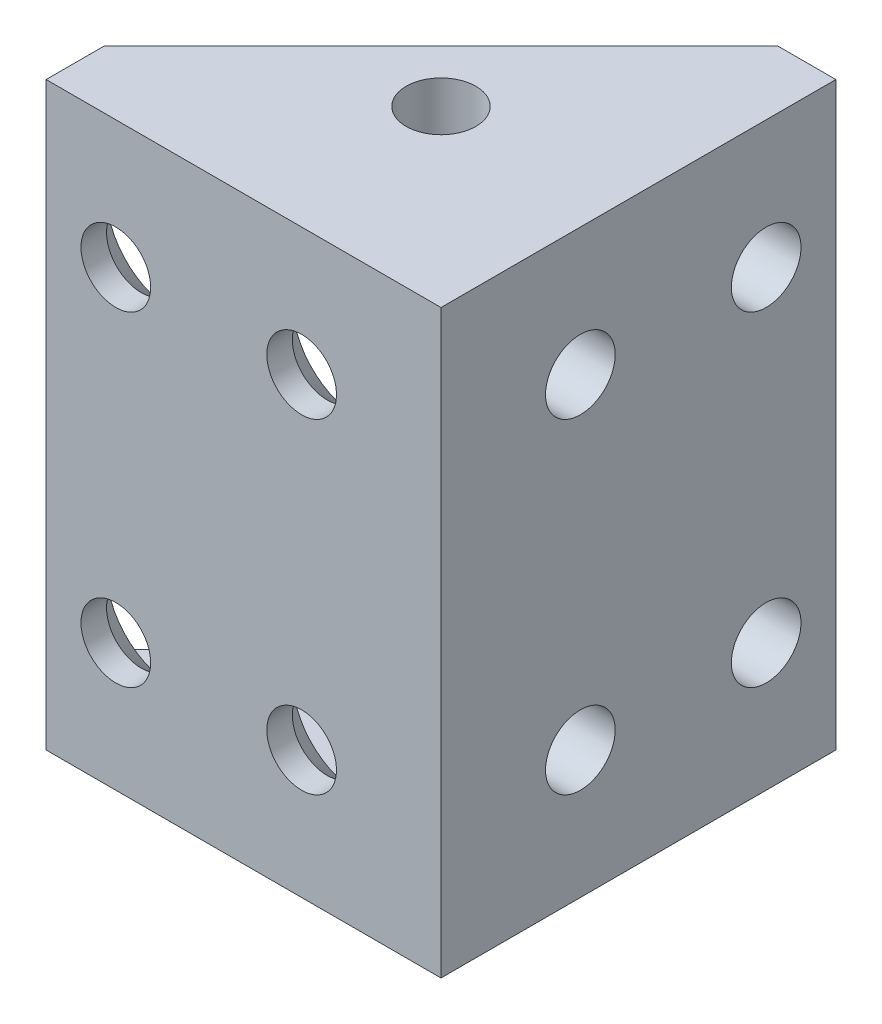
ISO-10303-21;
HEADER;
FILE_DESCRIPTION(('STEP AP214'),'2;1');
FILE_NAME('part.step','',(''),(''),'','','');
FILE_SCHEMA(('AUTOMOTIVE_DESIGN { 1 0 10303 214 1 1 1 1 }'));
ENDSEC;
DATA;
#1=APPLICATION_CONTEXT('core data for automotive mechanical design processes');
#2=APPLICATION_PROTOCOL_DEFINITION('international standard','automotive_design',2000,#1);
#3=PRODUCT_CONTEXT('',#1,'mechanical');
#4=PRODUCT('Part','Part','',(#3));
#5=PRODUCT_RELATED_PRODUCT_CATEGORY('part','',(#4));
#6=PRODUCT_DEFINITION_FORMATION('','',#4);
#7=PRODUCT_DEFINITION_CONTEXT('part definition',#1,'design');
#8=PRODUCT_DEFINITION('design','',#6,#7);
#9=PRODUCT_DEFINITION_SHAPE('','',#8);
#10=(LENGTH_UNIT() NAMED_UNIT(*) SI_UNIT(.MILLI.,.METRE.));
#11=(NAMED_UNIT(*) PLANE_ANGLE_UNIT() SI_UNIT($,.RADIAN.));
#12=(NAMED_UNIT(*) SI_UNIT($,.STERADIAN.) SOLID_ANGLE_UNIT());
#13=UNCERTAINTY_MEASURE_WITH_UNIT(LENGTH_MEASURE(1.E-05),#10,'distance_accuracy_value','');
#14=(GEOMETRIC_REPRESENTATION_CONTEXT(3) GLOBAL_UNCERTAINTY_ASSIGNED_CONTEXT((#13)) GLOBAL_UNIT_ASSIGNED_CONTEXT((#10,
#11,#12)) REPRESENTATION_CONTEXT('',''));
#15=CARTESIAN_POINT('',(0.,0.,0.));
#16=DIRECTION('',(0.,0.,1.));
#17=DIRECTION('',(1.,0.,0.));
#18=AXIS2_PLACEMENT_3D('',#15,#16,#17);
#19=CARTESIAN_POINT('',(-8.5,25.,-1.25));
#20=DIRECTION('',(0.,0.,1.));
#21=DIRECTION('',(1.,0.,0.));
#22=AXIS2_PLACEMENT_3D('',#19,#20,#21);
#23=PLANE('',#22);
#24=CARTESIAN_POINT('',(2.5,5.5,-1.25));
#25=DIRECTION('',(0.,0.,-1.));
#26=DIRECTION('',(-1.,0.,0.));
#27=AXIS2_PLACEMENT_3D('',#24,#25,#26);
#28=CIRCLE('',#27,2.9);
#29=CARTESIAN_POINT('',(-0.399999999999998,5.5,-1.25));
#30=VERTEX_POINT('',#29);
#31=EDGE_CURVE('E334',#30,#30,#28,.T.);
#32=ORIENTED_EDGE('',*,*,#31,.F.);
#33=EDGE_LOOP('',(#32));
#34=FACE_BOUND('',#33,.T.);
#35=CARTESIAN_POINT('',(2.5,19.5,-1.25));
#36=DIRECTION('',(0.,0.,-1.));
#37=DIRECTION('',(-1.,0.,0.));
#38=AXIS2_PLACEMENT_3D('',#35,#36,#37);
#39=CIRCLE('',#38,2.9);
#40=CARTESIAN_POINT('',(-0.399999999999997,19.5,-1.25));
#41=VERTEX_POINT('',#40);
#42=EDGE_CURVE('E345',#41,#41,#39,.T.);
#43=ORIENTED_EDGE('',*,*,#42,.F.);
#44=EDGE_LOOP('',(#43));
#45=FACE_BOUND('',#44,.T.);
#46=DIRECTION('',(0.,-1.,0.));
#47=VECTOR('',#46,1.);
#48=CARTESIAN_POINT('',(-8.5,25.,-1.25));
#49=LINE('',#48,#47);
#50=CARTESIAN_POINT('',(-8.5,22.5,-1.25));
#51=VERTEX_POINT('',#50);
#52=CARTESIAN_POINT('',(-8.5,2.5,-1.25));
#53=VERTEX_POINT('',#52);
#54=EDGE_CURVE('E42',#51,#53,#49,.T.);
#55=ORIENTED_EDGE('',*,*,#54,.F.);
#56=DIRECTION('',(1.,0.,0.));
#57=VECTOR('',#56,1.);
#58=CARTESIAN_POINT('',(6.00000000000001,22.5,-1.25));
#59=LINE('',#58,#57);
#60=CARTESIAN_POINT('',(6.00000000000001,22.5,-1.25));
#61=VERTEX_POINT('',#60);
#62=EDGE_CURVE('E100',#51,#61,#59,.T.);
#63=ORIENTED_EDGE('',*,*,#62,.T.);
#64=DIRECTION('',(0.,-1.,0.));
#65=VECTOR('',#64,1.);
#66=CARTESIAN_POINT('',(6.00000000000001,25.,-1.25));
#67=LINE('',#66,#65);
#68=CARTESIAN_POINT('',(6.00000000000001,2.5,-1.25));
#69=VERTEX_POINT('',#68);
#70=EDGE_CURVE('E142',#61,#69,#67,.T.);
#71=ORIENTED_EDGE('',*,*,#70,.T.);
#72=DIRECTION('',(-1.,0.,0.));
#73=VECTOR('',#72,1.);
#74=CARTESIAN_POINT('',(6.00000000000001,2.5,-1.25));
#75=LINE('',#74,#73);
#76=EDGE_CURVE('E118',#69,#53,#75,.T.);
#77=ORIENTED_EDGE('',*,*,#76,.T.);
#78=EDGE_LOOP('',(#55,#63,#71,#77));
#79=FACE_BOUND('',#78,.T.);
#80=CARTESIAN_POINT('',(-5.5,19.5,-1.25));
#81=DIRECTION('',(0.,0.,-1.));
#82=DIRECTION('',(-1.,0.,0.));
#83=AXIS2_PLACEMENT_3D('',#80,#81,#82);
#84=CIRCLE('',#83,2.9);
#85=CARTESIAN_POINT('',(-8.4,19.5,-1.25));
#86=VERTEX_POINT('',#85);
#87=EDGE_CURVE('E349',#86,#86,#84,.T.);
#88=ORIENTED_EDGE('',*,*,#87,.F.);
#89=EDGE_LOOP('',(#88));
#90=FACE_BOUND('',#89,.T.);
#91=CARTESIAN_POINT('',(-5.5,5.5,-1.25));
#92=DIRECTION('',(0.,0.,-1.));
#93=DIRECTION('',(-1.,0.,0.));
#94=AXIS2_PLACEMENT_3D('',#91,#92,#93);
#95=CIRCLE('',#94,2.9);
#96=CARTESIAN_POINT('',(-8.4,5.5,-1.25));
#97=VERTEX_POINT('',#96);
#98=EDGE_CURVE('E335',#97,#97,#95,.T.);
#99=ORIENTED_EDGE('',*,*,#98,.F.);
#100=EDGE_LOOP('',(#99));
#101=FACE_BOUND('',#100,.T.);
#102=ADVANCED_FACE('F34',(#34,#45,#79,#90,#101),#23,.F.);
#103=CARTESIAN_POINT('',(6.00000000000001,25.,-1.25));
#104=DIRECTION('',(1.,0.,0.));
#105=DIRECTION('',(0.,0.,-1.));
#106=AXIS2_PLACEMENT_3D('',#103,#104,#105);
#107=PLANE('',#106);
#108=CARTESIAN_POINT('',(6.,5.5,-12.75));
#109=DIRECTION('',(-1.,0.,0.));
#110=DIRECTION('',(0.,0.,1.));
#111=AXIS2_PLACEMENT_3D('',#108,#109,#110);
#112=CIRCLE('',#111,1.5);
#113=CARTESIAN_POINT('',(6.,5.5,-11.25));
#114=VERTEX_POINT('',#113);
#115=EDGE_CURVE('E291',#114,#114,#112,.T.);
#116=ORIENTED_EDGE('',*,*,#115,.F.);
#117=EDGE_LOOP('',(#116));
#118=FACE_BOUND('',#117,.T.);
#119=CARTESIAN_POINT('',(6.00000000000001,19.5,-4.75));
#120=DIRECTION('',(-1.,0.,0.));
#121=DIRECTION('',(0.,0.,1.));
#122=AXIS2_PLACEMENT_3D('',#119,#120,#121);
#123=CIRCLE('',#122,1.5);
#124=CARTESIAN_POINT('',(6.00000000000001,19.5,-3.25));
#125=VERTEX_POINT('',#124);
#126=EDGE_CURVE('E284',#125,#125,#123,.T.);
#127=ORIENTED_EDGE('',*,*,#126,.F.);
#128=EDGE_LOOP('',(#127));
#129=FACE_BOUND('',#128,.T.);
#130=CARTESIAN_POINT('',(6.00000000000001,5.5,-4.75));
#131=DIRECTION('',(-1.,0.,0.));
#132=DIRECTION('',(0.,0.,1.));
#133=AXIS2_PLACEMENT_3D('',#130,#131,#132);
#134=CIRCLE('',#133,1.5);
#135=CARTESIAN_POINT('',(6.00000000000001,5.5,-3.25));
#136=VERTEX_POINT('',#135);
#137=EDGE_CURVE('E280',#136,#136,#134,.T.);
#138=ORIENTED_EDGE('',*,*,#137,.F.);
#139=EDGE_LOOP('',(#138));
#140=FACE_BOUND('',#139,.T.);
#141=CARTESIAN_POINT('',(6.,19.5,-12.75));
#142=DIRECTION('',(-1.,0.,0.));
#143=DIRECTION('',(0.,0.,1.));
#144=AXIS2_PLACEMENT_3D('',#141,#142,#143);
#145=CIRCLE('',#144,1.5);
#146=CARTESIAN_POINT('',(6.,19.5,-11.25));
#147=VERTEX_POINT('',#146);
#148=EDGE_CURVE('E290',#147,#147,#145,.T.);
#149=ORIENTED_EDGE('',*,*,#148,.F.);
#150=EDGE_LOOP('',(#149));
#151=FACE_BOUND('',#150,.T.);
#152=ORIENTED_EDGE('',*,*,#70,.F.);
#153=DIRECTION('',(0.,0.,-1.));
#154=VECTOR('',#153,1.);
#155=CARTESIAN_POINT('',(6.,22.5,-15.75));
#156=LINE('',#155,#154);
#157=CARTESIAN_POINT('',(6.,22.5,-15.75));
#158=VERTEX_POINT('',#157);
#159=EDGE_CURVE('E104',#61,#158,#156,.T.);
#160=ORIENTED_EDGE('',*,*,#159,.T.);
#161=DIRECTION('',(0.,-1.,0.));
#162=VECTOR('',#161,1.);
#163=CARTESIAN_POINT('',(6.,25.,-15.75));
#164=LINE('',#163,#162);
#165=CARTESIAN_POINT('',(6.,2.5,-15.75));
#166=VERTEX_POINT('',#165);
#167=EDGE_CURVE('E55',#158,#166,#164,.T.);
#168=ORIENTED_EDGE('',*,*,#167,.T.);
#169=DIRECTION('',(0.,0.,1.));
#170=VECTOR('',#169,1.);
#171=CARTESIAN_POINT('',(6.,2.5,-15.75));
#172=LINE('',#171,#170);
#173=EDGE_CURVE('E187',#166,#69,#172,.T.);
#174=ORIENTED_EDGE('',*,*,#173,.T.);
#175=EDGE_LOOP('',(#152,#160,#168,#174));
#176=FACE_BOUND('',#175,.T.);
#177=ADVANCED_FACE('F197',(#118,#129,#140,#151,#176),#107,.F.);
#178=CARTESIAN_POINT('',(-8.5,25.,1.25));
#179=DIRECTION('',(1.,0.,0.));
#180=DIRECTION('',(0.,0.,-1.));
#181=AXIS2_PLACEMENT_3D('',#178,#179,#180);
#182=PLANE('',#181);
#183=DIRECTION('',(0.,0.,1.));
#184=VECTOR('',#183,1.);
#185=CARTESIAN_POINT('',(-8.5,0.,1.25));
#186=LINE('',#185,#184);
#187=CARTESIAN_POINT('',(-8.5,0.,-1.25));
#188=VERTEX_POINT('',#187);
#189=CARTESIAN_POINT('',(-8.5,0.,1.25));
#190=VERTEX_POINT('',#189);
#191=EDGE_CURVE('E143',#188,#190,#186,.T.);
#192=ORIENTED_EDGE('',*,*,#191,.T.);
#193=DIRECTION('',(0.,-1.,0.));
#194=VECTOR('',#193,1.);
#195=CARTESIAN_POINT('',(-8.5,25.,1.25));
#196=LINE('',#195,#194);
#197=CARTESIAN_POINT('',(-8.5,25.,1.25));
#198=VERTEX_POINT('',#197);
#199=EDGE_CURVE('E120',#198,#190,#196,.T.);
#200=ORIENTED_EDGE('',*,*,#199,.F.);
#201=DIRECTION('',(0.,0.,1.));
#202=VECTOR('',#201,1.);
#203=CARTESIAN_POINT('',(-8.5,25.,1.25));
#204=LINE('',#203,#202);
#205=CARTESIAN_POINT('',(-8.5,25.,-1.25));
#206=VERTEX_POINT('',#205);
#207=EDGE_CURVE('E123',#206,#198,#204,.T.);
#208=ORIENTED_EDGE('',*,*,#207,.F.);
#209=EDGE_CURVE('E11',#206,#51,#49,.T.);
#210=ORIENTED_EDGE('',*,*,#209,.T.);
#211=ORIENTED_EDGE('',*,*,#54,.T.);
#212=DIRECTION('',(0.,-1.,0.));
#213=VECTOR('',#212,1.);
#214=CARTESIAN_POINT('',(-8.5,2.5,-1.25));
#215=LINE('',#214,#213);
#216=EDGE_CURVE('E146',#53,#188,#215,.T.);
#217=ORIENTED_EDGE('',*,*,#216,.T.);
#218=EDGE_LOOP('',(#192,#200,#208,#210,#211,#217));
#219=FACE_BOUND('',#218,.T.);
#220=ADVANCED_FACE('F121',(#219),#182,.F.);
#221=CARTESIAN_POINT('',(8.5,25.,1.25));
#222=DIRECTION('',(0.,0.,-1.));
#223=DIRECTION('',(-1.,0.,0.));
#224=AXIS2_PLACEMENT_3D('',#221,#222,#223);
#225=PLANE('',#224);
#226=CARTESIAN_POINT('',(2.5,5.5,1.25));
#227=DIRECTION('',(0.,0.,-1.));
#228=DIRECTION('',(-1.,0.,0.));
#229=AXIS2_PLACEMENT_3D('',#226,#227,#228);
#230=CIRCLE('',#229,1.5);
#231=CARTESIAN_POINT('',(1.,5.5,1.25));
#232=VERTEX_POINT('',#231);
#233=EDGE_CURVE('E223',#232,#232,#230,.T.);
#234=ORIENTED_EDGE('',*,*,#233,.T.);
#235=EDGE_LOOP('',(#234));
#236=FACE_BOUND('',#235,.T.);
#237=CARTESIAN_POINT('',(-5.5,5.5,1.25));
#238=DIRECTION('',(0.,0.,-1.));
#239=DIRECTION('',(-1.,0.,0.));
#240=AXIS2_PLACEMENT_3D('',#237,#238,#239);
#241=CIRCLE('',#240,1.5);
#242=CARTESIAN_POINT('',(-7.,5.5,1.25));
#243=VERTEX_POINT('',#242);
#244=EDGE_CURVE('E227',#243,#243,#241,.T.);
#245=ORIENTED_EDGE('',*,*,#244,.T.);
#246=EDGE_LOOP('',(#245));
#247=FACE_BOUND('',#246,.T.);
#248=CARTESIAN_POINT('',(-5.5,19.5,1.25));
#249=DIRECTION('',(0.,0.,-1.));
#250=DIRECTION('',(-1.,0.,0.));
#251=AXIS2_PLACEMENT_3D('',#248,#249,#250);
#252=CIRCLE('',#251,1.5);
#253=CARTESIAN_POINT('',(-7.,19.5,1.25));
#254=VERTEX_POINT('',#253);
#255=EDGE_CURVE('E180',#254,#254,#252,.T.);
#256=ORIENTED_EDGE('',*,*,#255,.T.);
#257=EDGE_LOOP('',(#256));
#258=FACE_BOUND('',#257,.T.);
#259=CARTESIAN_POINT('',(2.5,19.5,1.25));
#260=DIRECTION('',(0.,0.,-1.));
#261=DIRECTION('',(-1.,0.,0.));
#262=AXIS2_PLACEMENT_3D('',#259,#260,#261);
#263=CIRCLE('',#262,1.5);
#264=CARTESIAN_POINT('',(1.,19.5,1.25));
#265=VERTEX_POINT('',#264);
#266=EDGE_CURVE('E177',#265,#265,#263,.T.);
#267=ORIENTED_EDGE('',*,*,#266,.T.);
#268=EDGE_LOOP('',(#267));
#269=FACE_BOUND('',#268,.T.);
#270=DIRECTION('',(1.,0.,0.));
#271=VECTOR('',#270,1.);
#272=CARTESIAN_POINT('',(8.5,0.,1.25));
#273=LINE('',#272,#271);
#274=CARTESIAN_POINT('',(8.5,0.,1.25));
#275=VERTEX_POINT('',#274);
#276=EDGE_CURVE('E145',#190,#275,#273,.T.);
#277=ORIENTED_EDGE('',*,*,#276,.T.);
#278=DIRECTION('',(0.,-1.,0.));
#279=VECTOR('',#278,1.);
#280=CARTESIAN_POINT('',(8.5,25.,1.25));
#281=LINE('',#280,#279);
#282=CARTESIAN_POINT('',(8.5,25.,1.25));
#283=VERTEX_POINT('',#282);
#284=EDGE_CURVE('E155',#283,#275,#281,.T.);
#285=ORIENTED_EDGE('',*,*,#284,.F.);
#286=DIRECTION('',(1.,0.,0.));
#287=VECTOR('',#286,1.);
#288=CARTESIAN_POINT('',(8.5,25.,1.25));
#289=LINE('',#288,#287);
#290=EDGE_CURVE('E127',#198,#283,#289,.T.);
#291=ORIENTED_EDGE('',*,*,#290,.F.);
#292=ORIENTED_EDGE('',*,*,#199,.T.);
#293=EDGE_LOOP('',(#277,#285,#291,#292));
#294=FACE_BOUND('',#293,.T.);
#295=ADVANCED_FACE('F160',(#236,#247,#258,#269,#294),#225,.F.);
#296=CARTESIAN_POINT('',(8.5,25.,-15.75));
#297=DIRECTION('',(-1.,0.,0.));
#298=DIRECTION('',(0.,0.,1.));
#299=AXIS2_PLACEMENT_3D('',#296,#297,#298);
#300=PLANE('',#299);
#301=CARTESIAN_POINT('',(8.5,5.5,-12.75));
#302=DIRECTION('',(-1.,0.,0.));
#303=DIRECTION('',(0.,0.,1.));
#304=AXIS2_PLACEMENT_3D('',#301,#302,#303);
#305=CIRCLE('',#304,1.5);
#306=CARTESIAN_POINT('',(8.5,5.5,-11.25));
#307=VERTEX_POINT('',#306);
#308=EDGE_CURVE('E287',#307,#307,#305,.T.);
#309=ORIENTED_EDGE('',*,*,#308,.T.);
#310=EDGE_LOOP('',(#309));
#311=FACE_BOUND('',#310,.T.);
#312=CARTESIAN_POINT('',(8.50000000000001,19.5,-4.75));
#313=DIRECTION('',(-1.,0.,0.));
#314=DIRECTION('',(0.,0.,1.));
#315=AXIS2_PLACEMENT_3D('',#312,#313,#314);
#316=CIRCLE('',#315,1.5);
#317=CARTESIAN_POINT('',(8.50000000000001,19.5,-3.25));
#318=VERTEX_POINT('',#317);
#319=EDGE_CURVE('E294',#318,#318,#316,.T.);
#320=ORIENTED_EDGE('',*,*,#319,.T.);
#321=EDGE_LOOP('',(#320));
#322=FACE_BOUND('',#321,.T.);
#323=CARTESIAN_POINT('',(8.50000000000001,5.5,-4.75));
#324=DIRECTION('',(-1.,0.,0.));
#325=DIRECTION('',(0.,0.,1.));
#326=AXIS2_PLACEMENT_3D('',#323,#324,#325);
#327=CIRCLE('',#326,1.5);
#328=CARTESIAN_POINT('',(8.50000000000001,5.5,-3.25));
#329=VERTEX_POINT('',#328);
#330=EDGE_CURVE('E281',#329,#329,#327,.T.);
#331=ORIENTED_EDGE('',*,*,#330,.T.);
#332=EDGE_LOOP('',(#331));
#333=FACE_BOUND('',#332,.T.);
#334=CARTESIAN_POINT('',(8.5,19.5,-12.75));
#335=DIRECTION('',(-1.,0.,0.));
#336=DIRECTION('',(0.,0.,1.));
#337=AXIS2_PLACEMENT_3D('',#334,#335,#336);
#338=CIRCLE('',#337,1.5);
#339=CARTESIAN_POINT('',(8.5,19.5,-11.25));
#340=VERTEX_POINT('',#339);
#341=EDGE_CURVE('E299',#340,#340,#338,.T.);
#342=ORIENTED_EDGE('',*,*,#341,.T.);
#343=EDGE_LOOP('',(#342));
#344=FACE_BOUND('',#343,.T.);
#345=DIRECTION('',(0.,0.,-1.));
#346=VECTOR('',#345,1.);
#347=CARTESIAN_POINT('',(8.5,0.,-15.75));
#348=LINE('',#347,#346);
#349=CARTESIAN_POINT('',(8.5,0.,-15.75));
#350=VERTEX_POINT('',#349);
#351=EDGE_CURVE('E132',#275,#350,#348,.T.);
#352=ORIENTED_EDGE('',*,*,#351,.T.);
#353=DIRECTION('',(0.,-1.,0.));
#354=VECTOR('',#353,1.);
#355=CARTESIAN_POINT('',(8.5,25.,-15.75));
#356=LINE('',#355,#354);
#357=CARTESIAN_POINT('',(8.5,25.,-15.75));
#358=VERTEX_POINT('',#357);
#359=EDGE_CURVE('E152',#358,#350,#356,.T.);
#360=ORIENTED_EDGE('',*,*,#359,.F.);
#361=DIRECTION('',(0.,0.,-1.));
#362=VECTOR('',#361,1.);
#363=CARTESIAN_POINT('',(8.5,25.,1.25));
#364=LINE('',#363,#362);
#365=EDGE_CURVE('E130',#283,#358,#364,.T.);
#366=ORIENTED_EDGE('',*,*,#365,.F.);
#367=ORIENTED_EDGE('',*,*,#284,.T.);
#368=EDGE_LOOP('',(#352,#360,#366,#367));
#369=FACE_BOUND('',#368,.T.);
#370=ADVANCED_FACE('F170',(#311,#322,#333,#344,#369),#300,.F.);
#371=CARTESIAN_POINT('',(6.,25.,-15.75));
#372=DIRECTION('',(0.,0.,1.));
#373=DIRECTION('',(1.,0.,0.));
#374=AXIS2_PLACEMENT_3D('',#371,#372,#373);
#375=PLANE('',#374);
#376=DIRECTION('',(-1.,0.,0.));
#377=VECTOR('',#376,1.);
#378=CARTESIAN_POINT('',(6.,0.,-15.75));
#379=LINE('',#378,#377);
#380=CARTESIAN_POINT('',(6.,0.,-15.75));
#381=VERTEX_POINT('',#380);
#382=EDGE_CURVE('E128',#350,#381,#379,.T.);
#383=ORIENTED_EDGE('',*,*,#382,.T.);
#384=DIRECTION('',(0.,-1.,0.));
#385=VECTOR('',#384,1.);
#386=CARTESIAN_POINT('',(6.,2.5,-15.75));
#387=LINE('',#386,#385);
#388=EDGE_CURVE('E135',#166,#381,#387,.T.);
#389=ORIENTED_EDGE('',*,*,#388,.F.);
#390=ORIENTED_EDGE('',*,*,#167,.F.);
#391=CARTESIAN_POINT('',(6.,25.,-15.75));
#392=VERTEX_POINT('',#391);
#393=EDGE_CURVE('E113',#392,#158,#164,.T.);
#394=ORIENTED_EDGE('',*,*,#393,.F.);
#395=DIRECTION('',(-1.,0.,0.));
#396=VECTOR('',#395,1.);
#397=CARTESIAN_POINT('',(6.,25.,-15.75));
#398=LINE('',#397,#396);
#399=EDGE_CURVE('E139',#358,#392,#398,.T.);
#400=ORIENTED_EDGE('',*,*,#399,.F.);
#401=ORIENTED_EDGE('',*,*,#359,.T.);
#402=EDGE_LOOP('',(#383,#389,#390,#394,#400,#401));
#403=FACE_BOUND('',#402,.T.);
#404=ADVANCED_FACE('F174',(#403),#375,.F.);
#405=CARTESIAN_POINT('',(0.,25.,0.));
#406=DIRECTION('',(0.,1.,0.));
#407=DIRECTION('',(0.,0.,1.));
#408=AXIS2_PLACEMENT_3D('',#405,#406,#407);
#409=PLANE('',#408);
#410=CARTESIAN_POINT('',(1.,25.,-6.25));
#411=DIRECTION('',(0.,-1.,0.));
#412=DIRECTION('',(0.,0.,-1.));
#413=AXIS2_PLACEMENT_3D('',#410,#411,#412);
#414=CIRCLE('',#413,1.5);
#415=CARTESIAN_POINT('',(1.,25.,-7.75));
#416=VERTEX_POINT('',#415);
#417=EDGE_CURVE('E266',#416,#416,#414,.T.);
#418=ORIENTED_EDGE('',*,*,#417,.T.);
#419=EDGE_LOOP('',(#418));
#420=FACE_BOUND('',#419,.T.);
#421=ORIENTED_EDGE('',*,*,#399,.T.);
#422=DIRECTION('',(-0.707106781186548,0.,0.707106781186548));
#423=VECTOR('',#422,1.);
#424=CARTESIAN_POINT('',(-8.5,25.,-1.25));
#425=LINE('',#424,#423);
#426=EDGE_CURVE('E114',#392,#206,#425,.T.);
#427=ORIENTED_EDGE('',*,*,#426,.T.);
#428=ORIENTED_EDGE('',*,*,#207,.T.);
#429=ORIENTED_EDGE('',*,*,#290,.T.);
#430=ORIENTED_EDGE('',*,*,#365,.T.);
#431=EDGE_LOOP('',(#421,#427,#428,#429,#430));
#432=FACE_BOUND('',#431,.T.);
#433=ADVANCED_FACE('F176',(#420,#432),#409,.T.);
#434=CARTESIAN_POINT('',(0.,0.,0.));
#435=DIRECTION('',(0.,1.,0.));
#436=DIRECTION('',(0.,0.,1.));
#437=AXIS2_PLACEMENT_3D('',#434,#435,#436);
#438=PLANE('',#437);
#439=CARTESIAN_POINT('',(1.,0.,-6.25));
#440=DIRECTION('',(0.,-1.,0.));
#441=DIRECTION('',(0.,0.,-1.));
#442=AXIS2_PLACEMENT_3D('',#439,#440,#441);
#443=CIRCLE('',#442,1.5);
#444=CARTESIAN_POINT('',(1.,0.,-7.75));
#445=VERTEX_POINT('',#444);
#446=EDGE_CURVE('E268',#445,#445,#443,.T.);
#447=ORIENTED_EDGE('',*,*,#446,.F.);
#448=EDGE_LOOP('',(#447));
#449=FACE_BOUND('',#448,.T.);
#450=ORIENTED_EDGE('',*,*,#191,.F.);
#451=DIRECTION('',(0.707106781186548,0.,-0.707106781186548));
#452=VECTOR('',#451,1.);
#453=CARTESIAN_POINT('',(-8.5,0.,-1.25));
#454=LINE('',#453,#452);
#455=EDGE_CURVE('E188',#188,#381,#454,.T.);
#456=ORIENTED_EDGE('',*,*,#455,.T.);
#457=ORIENTED_EDGE('',*,*,#382,.F.);
#458=ORIENTED_EDGE('',*,*,#351,.F.);
#459=ORIENTED_EDGE('',*,*,#276,.F.);
#460=EDGE_LOOP('',(#450,#456,#457,#458,#459));
#461=FACE_BOUND('',#460,.T.);
#462=ADVANCED_FACE('F164',(#449,#461),#438,.F.);
#463=CARTESIAN_POINT('',(-8.5,2.5,-1.25));
#464=DIRECTION('',(-0.707106781186548,0.,-0.707106781186548));
#465=DIRECTION('',(-0.707106781186548,0.,0.707106781186548));
#466=AXIS2_PLACEMENT_3D('',#463,#464,#465);
#467=PLANE('',#466);
#468=ORIENTED_EDGE('',*,*,#455,.F.);
#469=ORIENTED_EDGE('',*,*,#216,.F.);
#470=DIRECTION('',(0.707106781186548,0.,-0.707106781186548));
#471=VECTOR('',#470,1.);
#472=CARTESIAN_POINT('',(-8.5,2.5,-1.25));
#473=LINE('',#472,#471);
#474=EDGE_CURVE('E184',#53,#166,#473,.T.);
#475=ORIENTED_EDGE('',*,*,#474,.T.);
#476=ORIENTED_EDGE('',*,*,#388,.T.);
#477=EDGE_LOOP('',(#468,#469,#475,#476));
#478=FACE_BOUND('',#477,.T.);
#479=ADVANCED_FACE('F192',(#478),#467,.T.);
#480=CARTESIAN_POINT('',(0.,2.5,0.));
#481=DIRECTION('',(0.,-1.,0.));
#482=DIRECTION('',(0.,0.,-1.));
#483=AXIS2_PLACEMENT_3D('',#480,#481,#482);
#484=PLANE('',#483);
#485=CARTESIAN_POINT('',(1.,2.5,-6.25));
#486=DIRECTION('',(0.,-1.,0.));
#487=DIRECTION('',(0.,0.,-1.));
#488=AXIS2_PLACEMENT_3D('',#485,#486,#487);
#489=CIRCLE('',#488,1.5);
#490=CARTESIAN_POINT('',(1.,2.5,-7.75));
#491=VERTEX_POINT('',#490);
#492=EDGE_CURVE('E271',#491,#491,#489,.T.);
#493=ORIENTED_EDGE('',*,*,#492,.T.);
#494=EDGE_LOOP('',(#493));
#495=FACE_BOUND('',#494,.T.);
#496=ORIENTED_EDGE('',*,*,#474,.F.);
#497=ORIENTED_EDGE('',*,*,#76,.F.);
#498=ORIENTED_EDGE('',*,*,#173,.F.);
#499=EDGE_LOOP('',(#496,#497,#498));
#500=FACE_BOUND('',#499,.T.);
#501=ADVANCED_FACE('F196',(#495,#500),#484,.F.);
#502=CARTESIAN_POINT('',(-8.5,22.5,-1.25));
#503=DIRECTION('',(-0.707106781186548,0.,-0.707106781186548));
#504=DIRECTION('',(-0.707106781186548,0.,0.707106781186548));
#505=AXIS2_PLACEMENT_3D('',#502,#503,#504);
#506=PLANE('',#505);
#507=ORIENTED_EDGE('',*,*,#426,.F.);
#508=ORIENTED_EDGE('',*,*,#393,.T.);
#509=DIRECTION('',(-0.707106781186548,0.,0.707106781186548));
#510=VECTOR('',#509,1.);
#511=CARTESIAN_POINT('',(-8.5,22.5,-1.25));
#512=LINE('',#511,#510);
#513=EDGE_CURVE('E103',#158,#51,#512,.T.);
#514=ORIENTED_EDGE('',*,*,#513,.T.);
#515=ORIENTED_EDGE('',*,*,#209,.F.);
#516=EDGE_LOOP('',(#507,#508,#514,#515));
#517=FACE_BOUND('',#516,.T.);
#518=ADVANCED_FACE('F110',(#517),#506,.T.);
#519=CARTESIAN_POINT('',(0.,22.5,0.));
#520=DIRECTION('',(0.,-1.,0.));
#521=DIRECTION('',(0.,0.,-1.));
#522=AXIS2_PLACEMENT_3D('',#519,#520,#521);
#523=PLANE('',#522);
#524=CARTESIAN_POINT('',(1.,22.5,-6.25));
#525=DIRECTION('',(0.,-1.,0.));
#526=DIRECTION('',(0.,0.,-1.));
#527=AXIS2_PLACEMENT_3D('',#524,#525,#526);
#528=CIRCLE('',#527,1.5);
#529=CARTESIAN_POINT('',(1.,22.5,-7.75));
#530=VERTEX_POINT('',#529);
#531=EDGE_CURVE('E37',#530,#530,#528,.T.);
#532=ORIENTED_EDGE('',*,*,#531,.F.);
#533=EDGE_LOOP('',(#532));
#534=FACE_BOUND('',#533,.T.);
#535=ORIENTED_EDGE('',*,*,#513,.F.);
#536=ORIENTED_EDGE('',*,*,#159,.F.);
#537=ORIENTED_EDGE('',*,*,#62,.F.);
#538=EDGE_LOOP('',(#535,#536,#537));
#539=FACE_BOUND('',#538,.T.);
#540=ADVANCED_FACE('F102',(#534,#539),#523,.T.);
#541=CARTESIAN_POINT('',(2.5,19.5,1.25));
#542=DIRECTION('',(0.,0.,-1.));
#543=DIRECTION('',(-1.,0.,0.));
#544=AXIS2_PLACEMENT_3D('',#541,#542,#543);
#545=CYLINDRICAL_SURFACE('',#544,1.5);
#546=CARTESIAN_POINT('',(2.5,19.5,0.150000000000001));
#547=DIRECTION('',(0.,0.,-1.));
#548=DIRECTION('',(-1.,0.,0.));
#549=AXIS2_PLACEMENT_3D('',#546,#547,#548);
#550=CIRCLE('',#549,1.5);
#551=CARTESIAN_POINT('',(1.,19.5,0.150000000000001));
#552=VERTEX_POINT('',#551);
#553=EDGE_CURVE('E348',#552,#552,#550,.T.);
#554=ORIENTED_EDGE('',*,*,#553,.T.);
#555=EDGE_LOOP('',(#554));
#556=FACE_BOUND('',#555,.T.);
#557=ORIENTED_EDGE('',*,*,#266,.F.);
#558=EDGE_LOOP('',(#557));
#559=FACE_BOUND('',#558,.T.);
#560=ADVANCED_FACE('F233',(#556,#559),#545,.F.);
#561=CARTESIAN_POINT('',(-5.5,19.5,1.25));
#562=DIRECTION('',(0.,0.,-1.));
#563=DIRECTION('',(-1.,0.,0.));
#564=AXIS2_PLACEMENT_3D('',#561,#562,#563);
#565=CYLINDRICAL_SURFACE('',#564,1.5);
#566=CARTESIAN_POINT('',(-5.5,19.5,0.150000000000003));
#567=DIRECTION('',(0.,0.,-1.));
#568=DIRECTION('',(-1.,0.,0.));
#569=AXIS2_PLACEMENT_3D('',#566,#567,#568);
#570=CIRCLE('',#569,1.5);
#571=CARTESIAN_POINT('',(-7.,19.5,0.150000000000003));
#572=VERTEX_POINT('',#571);
#573=EDGE_CURVE('E273',#572,#572,#570,.T.);
#574=ORIENTED_EDGE('',*,*,#573,.T.);
#575=EDGE_LOOP('',(#574));
#576=FACE_BOUND('',#575,.T.);
#577=ORIENTED_EDGE('',*,*,#255,.F.);
#578=EDGE_LOOP('',(#577));
#579=FACE_BOUND('',#578,.T.);
#580=ADVANCED_FACE('F235',(#576,#579),#565,.F.);
#581=CARTESIAN_POINT('',(-5.5,5.5,1.25));
#582=DIRECTION('',(0.,0.,-1.));
#583=DIRECTION('',(-1.,0.,0.));
#584=AXIS2_PLACEMENT_3D('',#581,#582,#583);
#585=CYLINDRICAL_SURFACE('',#584,1.5);
#586=CARTESIAN_POINT('',(-5.5,5.5,0.150000000000003));
#587=DIRECTION('',(0.,0.,-1.));
#588=DIRECTION('',(-1.,0.,0.));
#589=AXIS2_PLACEMENT_3D('',#586,#587,#588);
#590=CIRCLE('',#589,1.5);
#591=CARTESIAN_POINT('',(-7.,5.5,0.150000000000003));
#592=VERTEX_POINT('',#591);
#593=EDGE_CURVE('E332',#592,#592,#590,.T.);
#594=ORIENTED_EDGE('',*,*,#593,.T.);
#595=EDGE_LOOP('',(#594));
#596=FACE_BOUND('',#595,.T.);
#597=ORIENTED_EDGE('',*,*,#244,.F.);
#598=EDGE_LOOP('',(#597));
#599=FACE_BOUND('',#598,.T.);
#600=ADVANCED_FACE('F242',(#596,#599),#585,.F.);
#601=CARTESIAN_POINT('',(2.5,5.5,1.25));
#602=DIRECTION('',(0.,0.,-1.));
#603=DIRECTION('',(-1.,0.,0.));
#604=AXIS2_PLACEMENT_3D('',#601,#602,#603);
#605=CYLINDRICAL_SURFACE('',#604,1.5);
#606=CARTESIAN_POINT('',(2.5,5.5,0.150000000000001));
#607=DIRECTION('',(0.,0.,-1.));
#608=DIRECTION('',(-1.,0.,0.));
#609=AXIS2_PLACEMENT_3D('',#606,#607,#608);
#610=CIRCLE('',#609,1.5);
#611=CARTESIAN_POINT('',(1.,5.5,0.150000000000001));
#612=VERTEX_POINT('',#611);
#613=EDGE_CURVE('E338',#612,#612,#610,.T.);
#614=ORIENTED_EDGE('',*,*,#613,.T.);
#615=EDGE_LOOP('',(#614));
#616=FACE_BOUND('',#615,.T.);
#617=ORIENTED_EDGE('',*,*,#233,.F.);
#618=EDGE_LOOP('',(#617));
#619=FACE_BOUND('',#618,.T.);
#620=ADVANCED_FACE('F249',(#616,#619),#605,.F.);
#621=CARTESIAN_POINT('',(8.5,19.5,-12.75));
#622=DIRECTION('',(-1.,0.,0.));
#623=DIRECTION('',(0.,0.,1.));
#624=AXIS2_PLACEMENT_3D('',#621,#622,#623);
#625=CYLINDRICAL_SURFACE('',#624,1.5);
#626=ORIENTED_EDGE('',*,*,#341,.F.);
#627=EDGE_LOOP('',(#626));
#628=FACE_BOUND('',#627,.T.);
#629=ORIENTED_EDGE('',*,*,#148,.T.);
#630=EDGE_LOOP('',(#629));
#631=FACE_BOUND('',#630,.T.);
#632=ADVANCED_FACE('F308',(#628,#631),#625,.F.);
#633=CARTESIAN_POINT('',(8.50000000000001,5.5,-4.75));
#634=DIRECTION('',(-1.,0.,0.));
#635=DIRECTION('',(0.,0.,1.));
#636=AXIS2_PLACEMENT_3D('',#633,#634,#635);
#637=CYLINDRICAL_SURFACE('',#636,1.5);
#638=ORIENTED_EDGE('',*,*,#330,.F.);
#639=EDGE_LOOP('',(#638));
#640=FACE_BOUND('',#639,.T.);
#641=ORIENTED_EDGE('',*,*,#137,.T.);
#642=EDGE_LOOP('',(#641));
#643=FACE_BOUND('',#642,.T.);
#644=ADVANCED_FACE('F311',(#640,#643),#637,.F.);
#645=CARTESIAN_POINT('',(8.50000000000001,19.5,-4.75));
#646=DIRECTION('',(-1.,0.,0.));
#647=DIRECTION('',(0.,0.,1.));
#648=AXIS2_PLACEMENT_3D('',#645,#646,#647);
#649=CYLINDRICAL_SURFACE('',#648,1.5);
#650=ORIENTED_EDGE('',*,*,#319,.F.);
#651=EDGE_LOOP('',(#650));
#652=FACE_BOUND('',#651,.T.);
#653=ORIENTED_EDGE('',*,*,#126,.T.);
#654=EDGE_LOOP('',(#653));
#655=FACE_BOUND('',#654,.T.);
#656=ADVANCED_FACE('F318',(#652,#655),#649,.F.);
#657=CARTESIAN_POINT('',(8.5,5.5,-12.75));
#658=DIRECTION('',(-1.,0.,0.));
#659=DIRECTION('',(0.,0.,1.));
#660=AXIS2_PLACEMENT_3D('',#657,#658,#659);
#661=CYLINDRICAL_SURFACE('',#660,1.5);
#662=ORIENTED_EDGE('',*,*,#308,.F.);
#663=EDGE_LOOP('',(#662));
#664=FACE_BOUND('',#663,.T.);
#665=ORIENTED_EDGE('',*,*,#115,.T.);
#666=EDGE_LOOP('',(#665));
#667=FACE_BOUND('',#666,.T.);
#668=ADVANCED_FACE('F374',(#664,#667),#661,.F.);
#669=CARTESIAN_POINT('',(1.,25.,-6.25));
#670=DIRECTION('',(0.,-1.,0.));
#671=DIRECTION('',(0.,0.,-1.));
#672=AXIS2_PLACEMENT_3D('',#669,#670,#671);
#673=CYLINDRICAL_SURFACE('',#672,1.5);
#674=ORIENTED_EDGE('',*,*,#531,.T.);
#675=EDGE_LOOP('',(#674));
#676=FACE_BOUND('',#675,.T.);
#677=ORIENTED_EDGE('',*,*,#417,.F.);
#678=EDGE_LOOP('',(#677));
#679=FACE_BOUND('',#678,.T.);
#680=ADVANCED_FACE('F369',(#676,#679),#673,.F.);
#681=ORIENTED_EDGE('',*,*,#446,.T.);
#682=EDGE_LOOP('',(#681));
#683=FACE_BOUND('',#682,.T.);
#684=ORIENTED_EDGE('',*,*,#492,.F.);
#685=EDGE_LOOP('',(#684));
#686=FACE_BOUND('',#685,.T.);
#687=ADVANCED_FACE('F360',(#683,#686),#673,.F.);
#688=CARTESIAN_POINT('',(-5.5,19.5,-1.25));
#689=DIRECTION('',(0.,0.,-1.));
#690=DIRECTION('',(-1.,0.,0.));
#691=AXIS2_PLACEMENT_3D('',#688,#689,#690);
#692=CONICAL_SURFACE('',#691,2.9,0.785398163397448);
#693=ORIENTED_EDGE('',*,*,#573,.F.);
#694=EDGE_LOOP('',(#693));
#695=FACE_BOUND('',#694,.T.);
#696=ORIENTED_EDGE('',*,*,#87,.T.);
#697=EDGE_LOOP('',(#696));
#698=FACE_BOUND('',#697,.T.);
#699=ADVANCED_FACE('F357',(#695,#698),#692,.F.);
#700=CARTESIAN_POINT('',(2.5,19.5,-1.25));
#701=DIRECTION('',(0.,0.,-1.));
#702=DIRECTION('',(-1.,0.,0.));
#703=AXIS2_PLACEMENT_3D('',#700,#701,#702);
#704=CONICAL_SURFACE('',#703,2.9,0.785398163397448);
#705=ORIENTED_EDGE('',*,*,#553,.F.);
#706=EDGE_LOOP('',(#705));
#707=FACE_BOUND('',#706,.T.);
#708=ORIENTED_EDGE('',*,*,#42,.T.);
#709=EDGE_LOOP('',(#708));
#710=FACE_BOUND('',#709,.T.);
#711=ADVANCED_FACE('F359',(#707,#710),#704,.F.);
#712=CARTESIAN_POINT('',(2.5,5.5,-1.25));
#713=DIRECTION('',(0.,0.,-1.));
#714=DIRECTION('',(-1.,0.,0.));
#715=AXIS2_PLACEMENT_3D('',#712,#713,#714);
#716=CONICAL_SURFACE('',#715,2.9,0.785398163397448);
#717=ORIENTED_EDGE('',*,*,#613,.F.);
#718=EDGE_LOOP('',(#717));
#719=FACE_BOUND('',#718,.T.);
#720=ORIENTED_EDGE('',*,*,#31,.T.);
#721=EDGE_LOOP('',(#720));
#722=FACE_BOUND('',#721,.T.);
#723=ADVANCED_FACE('F366',(#719,#722),#716,.F.);
#724=CARTESIAN_POINT('',(-5.5,5.5,-1.25));
#725=DIRECTION('',(0.,0.,-1.));
#726=DIRECTION('',(-1.,0.,0.));
#727=AXIS2_PLACEMENT_3D('',#724,#725,#726);
#728=CONICAL_SURFACE('',#727,2.9,0.785398163397448);
#729=ORIENTED_EDGE('',*,*,#593,.F.);
#730=EDGE_LOOP('',(#729));
#731=FACE_BOUND('',#730,.T.);
#732=ORIENTED_EDGE('',*,*,#98,.T.);
#733=EDGE_LOOP('',(#732));
#734=FACE_BOUND('',#733,.T.);
#735=ADVANCED_FACE('F520',(#731,#734),#728,.F.);
#736=CLOSED_SHELL('',(#102,#177,#220,#295,#370,#404,#433,#462,#479,#501,#518,#540,#560,#580,
#600,#620,#632,#644,#656,#668,#680,#687,#699,#711,#723,#735));
#737=MANIFOLD_SOLID_BREP('B2',#736);
#738=ADVANCED_BREP_SHAPE_REPRESENTATION('',(#18,#737),#14);
#739=SHAPE_DEFINITION_REPRESENTATION(#9,#738);
ENDSEC;
END-ISO-10303-21;
